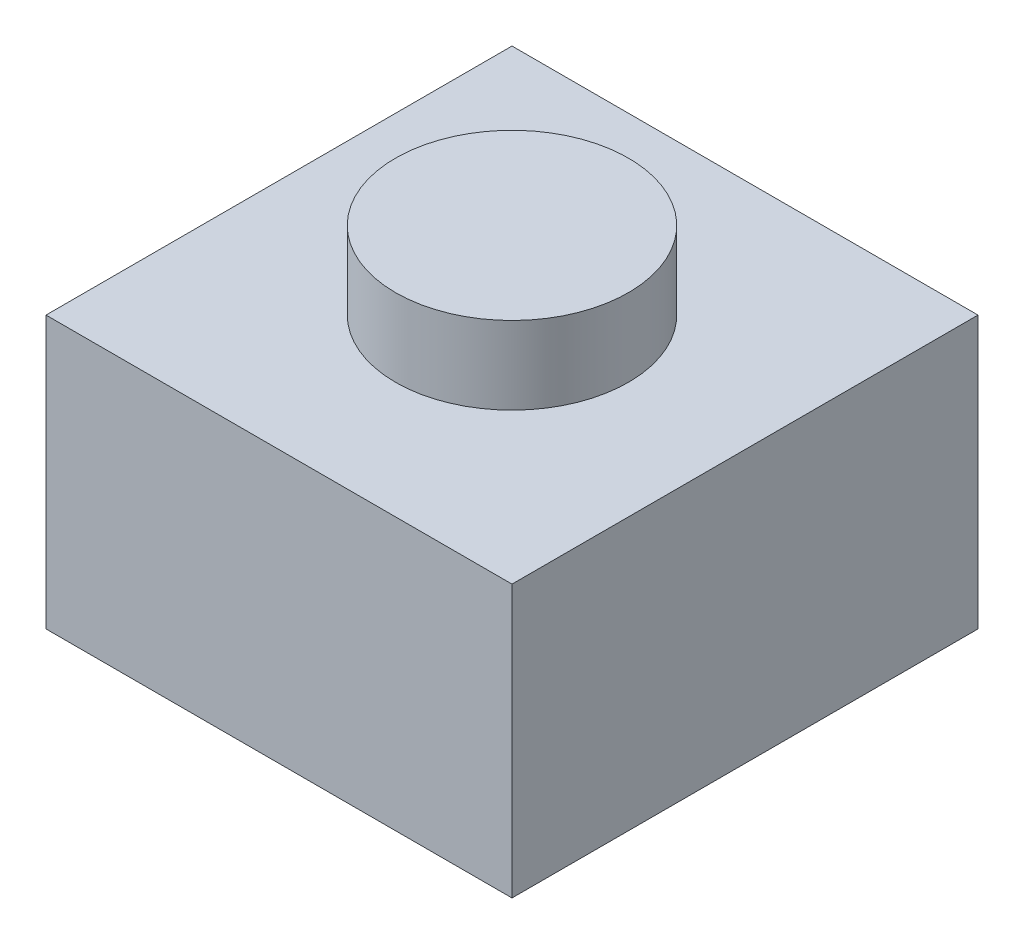
ISO-10303-21;
HEADER;
FILE_DESCRIPTION(('STEP AP214'),'2;1');
FILE_NAME('part.step','',(''),(''),'','','');
FILE_SCHEMA(('AUTOMOTIVE_DESIGN { 1 0 10303 214 1 1 1 1 }'));
ENDSEC;
DATA;
#1=APPLICATION_CONTEXT('core data for automotive mechanical design processes');
#2=APPLICATION_PROTOCOL_DEFINITION('international standard','automotive_design',2000,#1);
#3=PRODUCT_CONTEXT('',#1,'mechanical');
#4=PRODUCT('Part','Part','',(#3));
#5=PRODUCT_RELATED_PRODUCT_CATEGORY('part','',(#4));
#6=PRODUCT_DEFINITION_FORMATION('','',#4);
#7=PRODUCT_DEFINITION_CONTEXT('part definition',#1,'design');
#8=PRODUCT_DEFINITION('design','',#6,#7);
#9=PRODUCT_DEFINITION_SHAPE('','',#8);
#10=(LENGTH_UNIT() NAMED_UNIT(*) SI_UNIT(.MILLI.,.METRE.));
#11=(NAMED_UNIT(*) PLANE_ANGLE_UNIT() SI_UNIT($,.RADIAN.));
#12=(NAMED_UNIT(*) SI_UNIT($,.STERADIAN.) SOLID_ANGLE_UNIT());
#13=UNCERTAINTY_MEASURE_WITH_UNIT(LENGTH_MEASURE(1.E-05),#10,'distance_accuracy_value','');
#14=(GEOMETRIC_REPRESENTATION_CONTEXT(3) GLOBAL_UNCERTAINTY_ASSIGNED_CONTEXT((#13)) GLOBAL_UNIT_ASSIGNED_CONTEXT((#10,
#11,#12)) REPRESENTATION_CONTEXT('',''));
#15=CARTESIAN_POINT('',(0.,0.,0.));
#16=DIRECTION('',(0.,0.,1.));
#17=DIRECTION('',(1.,0.,0.));
#18=AXIS2_PLACEMENT_3D('',#15,#16,#17);
#19=CARTESIAN_POINT('',(0.,3.5,0.));
#20=DIRECTION('',(1.,0.,0.));
#21=DIRECTION('',(0.,0.,-1.));
#22=AXIS2_PLACEMENT_3D('',#19,#20,#21);
#23=PLANE('',#22);
#24=DIRECTION('',(0.,0.,1.));
#25=VECTOR('',#24,1.);
#26=CARTESIAN_POINT('',(0.,0.,0.));
#27=LINE('',#26,#25);
#28=CARTESIAN_POINT('',(0.,0.,0.));
#29=VERTEX_POINT('',#28);
#30=CARTESIAN_POINT('',(0.,0.,6.));
#31=VERTEX_POINT('',#30);
#32=EDGE_CURVE('E107',#29,#31,#27,.T.);
#33=ORIENTED_EDGE('',*,*,#32,.T.);
#34=DIRECTION('',(0.,-1.,0.));
#35=VECTOR('',#34,1.);
#36=CARTESIAN_POINT('',(0.,3.5,6.));
#37=LINE('',#36,#35);
#38=CARTESIAN_POINT('',(0.,3.5,6.));
#39=VERTEX_POINT('',#38);
#40=EDGE_CURVE('E44',#39,#31,#37,.T.);
#41=ORIENTED_EDGE('',*,*,#40,.F.);
#42=DIRECTION('',(0.,0.,1.));
#43=VECTOR('',#42,1.);
#44=CARTESIAN_POINT('',(0.,3.5,0.));
#45=LINE('',#44,#43);
#46=CARTESIAN_POINT('',(0.,3.5,0.));
#47=VERTEX_POINT('',#46);
#48=EDGE_CURVE('E94',#47,#39,#45,.T.);
#49=ORIENTED_EDGE('',*,*,#48,.F.);
#50=DIRECTION('',(0.,-1.,0.));
#51=VECTOR('',#50,1.);
#52=CARTESIAN_POINT('',(0.,3.5,0.));
#53=LINE('',#52,#51);
#54=EDGE_CURVE('E103',#47,#29,#53,.T.);
#55=ORIENTED_EDGE('',*,*,#54,.T.);
#56=EDGE_LOOP('',(#33,#41,#49,#55));
#57=FACE_BOUND('',#56,.T.);
#58=ADVANCED_FACE('F41',(#57),#23,.F.);
#59=CARTESIAN_POINT('',(0.,3.5,6.));
#60=DIRECTION('',(0.,0.,-1.));
#61=DIRECTION('',(-1.,0.,0.));
#62=AXIS2_PLACEMENT_3D('',#59,#60,#61);
#63=PLANE('',#62);
#64=DIRECTION('',(1.,0.,0.));
#65=VECTOR('',#64,1.);
#66=CARTESIAN_POINT('',(0.,0.,6.));
#67=LINE('',#66,#65);
#68=CARTESIAN_POINT('',(6.,0.,6.));
#69=VERTEX_POINT('',#68);
#70=EDGE_CURVE('E99',#31,#69,#67,.T.);
#71=ORIENTED_EDGE('',*,*,#70,.T.);
#72=DIRECTION('',(0.,-1.,0.));
#73=VECTOR('',#72,1.);
#74=CARTESIAN_POINT('',(6.,3.5,6.));
#75=LINE('',#74,#73);
#76=CARTESIAN_POINT('',(6.,3.5,6.));
#77=VERTEX_POINT('',#76);
#78=EDGE_CURVE('E97',#77,#69,#75,.T.);
#79=ORIENTED_EDGE('',*,*,#78,.F.);
#80=DIRECTION('',(1.,0.,0.));
#81=VECTOR('',#80,1.);
#82=CARTESIAN_POINT('',(0.,3.5,6.));
#83=LINE('',#82,#81);
#84=EDGE_CURVE('E89',#39,#77,#83,.T.);
#85=ORIENTED_EDGE('',*,*,#84,.F.);
#86=ORIENTED_EDGE('',*,*,#40,.T.);
#87=EDGE_LOOP('',(#71,#79,#85,#86));
#88=FACE_BOUND('',#87,.T.);
#89=ADVANCED_FACE('F98',(#88),#63,.F.);
#90=CARTESIAN_POINT('',(6.,3.5,0.));
#91=DIRECTION('',(-1.,0.,0.));
#92=DIRECTION('',(0.,0.,1.));
#93=AXIS2_PLACEMENT_3D('',#90,#91,#92);
#94=PLANE('',#93);
#95=DIRECTION('',(0.,0.,-1.));
#96=VECTOR('',#95,1.);
#97=CARTESIAN_POINT('',(6.,0.,0.));
#98=LINE('',#97,#96);
#99=CARTESIAN_POINT('',(6.,0.,0.));
#100=VERTEX_POINT('',#99);
#101=EDGE_CURVE('E75',#69,#100,#98,.T.);
#102=ORIENTED_EDGE('',*,*,#101,.T.);
#103=DIRECTION('',(0.,-1.,0.));
#104=VECTOR('',#103,1.);
#105=CARTESIAN_POINT('',(6.,3.5,0.));
#106=LINE('',#105,#104);
#107=CARTESIAN_POINT('',(6.,3.5,0.));
#108=VERTEX_POINT('',#107);
#109=EDGE_CURVE('E100',#108,#100,#106,.T.);
#110=ORIENTED_EDGE('',*,*,#109,.F.);
#111=DIRECTION('',(0.,0.,-1.));
#112=VECTOR('',#111,1.);
#113=CARTESIAN_POINT('',(6.,3.5,0.));
#114=LINE('',#113,#112);
#115=EDGE_CURVE('E92',#77,#108,#114,.T.);
#116=ORIENTED_EDGE('',*,*,#115,.F.);
#117=ORIENTED_EDGE('',*,*,#78,.T.);
#118=EDGE_LOOP('',(#102,#110,#116,#117));
#119=FACE_BOUND('',#118,.T.);
#120=ADVANCED_FACE('F101',(#119),#94,.F.);
#121=CARTESIAN_POINT('',(0.,3.5,0.));
#122=DIRECTION('',(0.,0.,1.));
#123=DIRECTION('',(1.,0.,0.));
#124=AXIS2_PLACEMENT_3D('',#121,#122,#123);
#125=PLANE('',#124);
#126=DIRECTION('',(-1.,0.,0.));
#127=VECTOR('',#126,1.);
#128=CARTESIAN_POINT('',(0.,0.,0.));
#129=LINE('',#128,#127);
#130=EDGE_CURVE('E81',#100,#29,#129,.T.);
#131=ORIENTED_EDGE('',*,*,#130,.T.);
#132=ORIENTED_EDGE('',*,*,#54,.F.);
#133=DIRECTION('',(-1.,0.,0.));
#134=VECTOR('',#133,1.);
#135=CARTESIAN_POINT('',(0.,3.5,0.));
#136=LINE('',#135,#134);
#137=EDGE_CURVE('E58',#108,#47,#136,.T.);
#138=ORIENTED_EDGE('',*,*,#137,.F.);
#139=ORIENTED_EDGE('',*,*,#109,.T.);
#140=EDGE_LOOP('',(#131,#132,#138,#139));
#141=FACE_BOUND('',#140,.T.);
#142=ADVANCED_FACE('F115',(#141),#125,.F.);
#143=CARTESIAN_POINT('',(0.,3.5,0.));
#144=DIRECTION('',(0.,1.,0.));
#145=DIRECTION('',(0.,0.,1.));
#146=AXIS2_PLACEMENT_3D('',#143,#144,#145);
#147=PLANE('',#146);
#148=CARTESIAN_POINT('',(3.,3.5,3.));
#149=DIRECTION('',(0.,1.,0.));
#150=DIRECTION('',(0.,0.,1.));
#151=AXIS2_PLACEMENT_3D('',#148,#149,#150);
#152=CIRCLE('',#151,1.5);
#153=CARTESIAN_POINT('',(3.,3.5,4.5));
#154=VERTEX_POINT('',#153);
#155=EDGE_CURVE('E11',#154,#154,#152,.T.);
#156=ORIENTED_EDGE('',*,*,#155,.F.);
#157=EDGE_LOOP('',(#156));
#158=FACE_BOUND('',#157,.T.);
#159=ORIENTED_EDGE('',*,*,#48,.T.);
#160=ORIENTED_EDGE('',*,*,#84,.T.);
#161=ORIENTED_EDGE('',*,*,#115,.T.);
#162=ORIENTED_EDGE('',*,*,#137,.T.);
#163=EDGE_LOOP('',(#159,#160,#161,#162));
#164=FACE_BOUND('',#163,.T.);
#165=ADVANCED_FACE('F90',(#158,#164),#147,.T.);
#166=CARTESIAN_POINT('',(0.,0.,0.));
#167=DIRECTION('',(0.,1.,0.));
#168=DIRECTION('',(0.,0.,1.));
#169=AXIS2_PLACEMENT_3D('',#166,#167,#168);
#170=PLANE('',#169);
#171=ORIENTED_EDGE('',*,*,#32,.F.);
#172=ORIENTED_EDGE('',*,*,#130,.F.);
#173=ORIENTED_EDGE('',*,*,#101,.F.);
#174=ORIENTED_EDGE('',*,*,#70,.F.);
#175=EDGE_LOOP('',(#171,#172,#173,#174));
#176=FACE_BOUND('',#175,.T.);
#177=ADVANCED_FACE('F118',(#176),#170,.F.);
#178=CARTESIAN_POINT('',(3.,4.5,3.));
#179=DIRECTION('',(0.,-1.,0.));
#180=DIRECTION('',(0.,0.,-1.));
#181=AXIS2_PLACEMENT_3D('',#178,#179,#180);
#182=CYLINDRICAL_SURFACE('',#181,1.5);
#183=CARTESIAN_POINT('',(3.,4.5,3.));
#184=DIRECTION('',(0.,1.,0.));
#185=DIRECTION('',(0.,0.,1.));
#186=AXIS2_PLACEMENT_3D('',#183,#184,#185);
#187=CIRCLE('',#186,1.5);
#188=CARTESIAN_POINT('',(3.,4.5,4.5));
#189=VERTEX_POINT('',#188);
#190=EDGE_CURVE('E110',#189,#189,#187,.T.);
#191=ORIENTED_EDGE('',*,*,#190,.F.);
#192=EDGE_LOOP('',(#191));
#193=FACE_BOUND('',#192,.T.);
#194=ORIENTED_EDGE('',*,*,#155,.T.);
#195=EDGE_LOOP('',(#194));
#196=FACE_BOUND('',#195,.T.);
#197=ADVANCED_FACE('F126',(#193,#196),#182,.T.);
#198=CARTESIAN_POINT('',(3.,4.5,3.));
#199=DIRECTION('',(0.,1.,0.));
#200=DIRECTION('',(0.,0.,1.));
#201=AXIS2_PLACEMENT_3D('',#198,#199,#200);
#202=PLANE('',#201);
#203=ORIENTED_EDGE('',*,*,#190,.T.);
#204=EDGE_LOOP('',(#203));
#205=FACE_BOUND('',#204,.T.);
#206=ADVANCED_FACE('F124',(#205),#202,.T.);
#207=CLOSED_SHELL('',(#58,#89,#120,#142,#165,#177,#197,#206));
#208=MANIFOLD_SOLID_BREP('B2',#207);
#209=ADVANCED_BREP_SHAPE_REPRESENTATION('',(#18,#208),#14);
#210=SHAPE_DEFINITION_REPRESENTATION(#9,#209);
ENDSEC;
END-ISO-10303-21;
